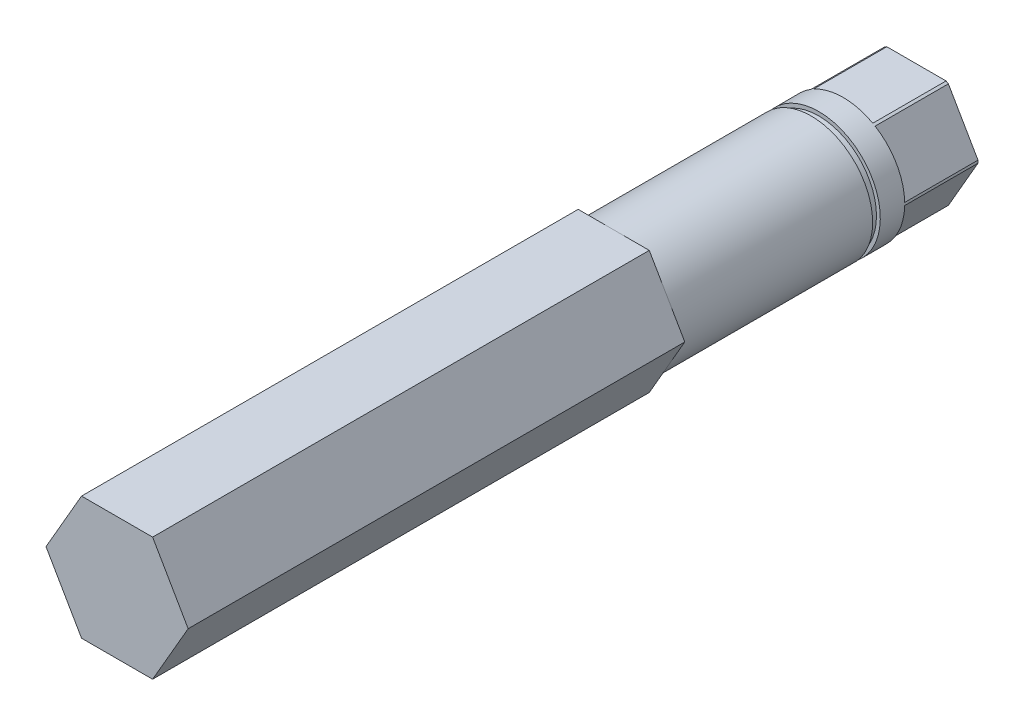
ISO-10303-21;
HEADER;
FILE_DESCRIPTION(('STEP AP214'),'2;1');
FILE_NAME('part.step','',(''),(''),'','','');
FILE_SCHEMA(('AUTOMOTIVE_DESIGN { 1 0 10303 214 1 1 1 1 }'));
ENDSEC;
DATA;
#1=APPLICATION_CONTEXT('core data for automotive mechanical design processes');
#2=APPLICATION_PROTOCOL_DEFINITION('international standard','automotive_design',2000,#1);
#3=PRODUCT_CONTEXT('',#1,'mechanical');
#4=PRODUCT('Part','Part','',(#3));
#5=PRODUCT_RELATED_PRODUCT_CATEGORY('part','',(#4));
#6=PRODUCT_DEFINITION_FORMATION('','',#4);
#7=PRODUCT_DEFINITION_CONTEXT('part definition',#1,'design');
#8=PRODUCT_DEFINITION('design','',#6,#7);
#9=PRODUCT_DEFINITION_SHAPE('','',#8);
#10=(LENGTH_UNIT() NAMED_UNIT(*) SI_UNIT(.MILLI.,.METRE.));
#11=(NAMED_UNIT(*) PLANE_ANGLE_UNIT() SI_UNIT($,.RADIAN.));
#12=(NAMED_UNIT(*) SI_UNIT($,.STERADIAN.) SOLID_ANGLE_UNIT());
#13=UNCERTAINTY_MEASURE_WITH_UNIT(LENGTH_MEASURE(1.E-05),#10,'distance_accuracy_value','');
#14=(GEOMETRIC_REPRESENTATION_CONTEXT(3) GLOBAL_UNCERTAINTY_ASSIGNED_CONTEXT((#13)) GLOBAL_UNIT_ASSIGNED_CONTEXT((#10,
#11,#12)) REPRESENTATION_CONTEXT('',''));
#15=CARTESIAN_POINT('',(0.,0.,0.));
#16=DIRECTION('',(0.,0.,1.));
#17=DIRECTION('',(1.,0.,0.));
#18=AXIS2_PLACEMENT_3D('',#15,#16,#17);
#19=CARTESIAN_POINT('',(-3.65884186093545,6.33729999999999,25.7302));
#20=DIRECTION('',(0.866025403784441,-0.499999999999995,0.));
#21=DIRECTION('',(0.499999999999995,0.866025403784441,0.));
#22=AXIS2_PLACEMENT_3D('',#19,#20,#21);
#23=PLANE('',#22);
#24=DIRECTION('',(-0.499999999999989,-0.866025403784445,0.));
#25=VECTOR('',#24,1.);
#26=CARTESIAN_POINT('',(-3.65884186093553,6.33729999999994,51.1302));
#27=LINE('',#26,#25);
#28=CARTESIAN_POINT('',(-3.65884186093553,6.33729999999994,51.1302));
#29=VERTEX_POINT('',#28);
#30=CARTESIAN_POINT('',(-7.31768372187083,0.,51.1302));
#31=VERTEX_POINT('',#30);
#32=EDGE_CURVE('E195',#29,#31,#27,.T.);
#33=ORIENTED_EDGE('',*,*,#32,.F.);
#34=DIRECTION('',(0.,0.,1.));
#35=VECTOR('',#34,1.);
#36=CARTESIAN_POINT('',(-3.65884186093544,6.3373,0.));
#37=LINE('',#36,#35);
#38=CARTESIAN_POINT('',(-3.65884186093545,6.33729999999999,0.));
#39=VERTEX_POINT('',#38);
#40=EDGE_CURVE('E201',#39,#29,#37,.T.);
#41=ORIENTED_EDGE('',*,*,#40,.F.);
#42=DIRECTION('',(0.499999999999995,0.866025403784441,0.));
#43=VECTOR('',#42,1.);
#44=CARTESIAN_POINT('',(-5.48826279140314,3.16864999999997,0.));
#45=LINE('',#44,#43);
#46=CARTESIAN_POINT('',(-5.48826279140314,3.16864999999997,0.));
#47=VERTEX_POINT('',#46);
#48=EDGE_CURVE('E317',#47,#39,#45,.T.);
#49=ORIENTED_EDGE('',*,*,#48,.F.);
#50=DIRECTION('',(0.499999999999995,0.866025403784442,0.));
#51=VECTOR('',#50,1.);
#52=CARTESIAN_POINT('',(-7.31768372187083,0.,0.));
#53=LINE('',#52,#51);
#54=CARTESIAN_POINT('',(-7.31768372187083,0.,0.));
#55=VERTEX_POINT('',#54);
#56=EDGE_CURVE('E198',#55,#47,#53,.T.);
#57=ORIENTED_EDGE('',*,*,#56,.F.);
#58=DIRECTION('',(0.,0.,1.));
#59=VECTOR('',#58,1.);
#60=CARTESIAN_POINT('',(-7.31768372187083,0.,0.));
#61=LINE('',#60,#59);
#62=EDGE_CURVE('E54',#55,#31,#61,.T.);
#63=ORIENTED_EDGE('',*,*,#62,.T.);
#64=EDGE_LOOP('',(#33,#41,#49,#57,#63));
#65=FACE_BOUND('',#64,.T.);
#66=ADVANCED_FACE('F45',(#65),#23,.F.);
#67=CARTESIAN_POINT('',(3.6588418609354,6.33730000000001,25.7302));
#68=DIRECTION('',(0.,-1.,0.));
#69=DIRECTION('',(1.,0.,0.));
#70=AXIS2_PLACEMENT_3D('',#67,#68,#69);
#71=PLANE('',#70);
#72=DIRECTION('',(-1.,0.,0.));
#73=VECTOR('',#72,1.);
#74=CARTESIAN_POINT('',(3.65884186093531,6.33730000000006,51.1302));
#75=LINE('',#74,#73);
#76=CARTESIAN_POINT('',(3.65884186093531,6.33730000000006,51.1302));
#77=VERTEX_POINT('',#76);
#78=EDGE_CURVE('E217',#77,#29,#75,.T.);
#79=ORIENTED_EDGE('',*,*,#78,.F.);
#80=DIRECTION('',(0.,0.,1.));
#81=VECTOR('',#80,1.);
#82=CARTESIAN_POINT('',(3.6588418609354,6.33730000000001,0.));
#83=LINE('',#82,#81);
#84=CARTESIAN_POINT('',(3.6588418609354,6.33730000000001,0.));
#85=VERTEX_POINT('',#84);
#86=EDGE_CURVE('E364',#85,#77,#83,.T.);
#87=ORIENTED_EDGE('',*,*,#86,.F.);
#88=DIRECTION('',(1.,0.,0.));
#89=VECTOR('',#88,1.);
#90=CARTESIAN_POINT('',(0.,6.33730000000001,0.));
#91=LINE('',#90,#89);
#92=CARTESIAN_POINT('',(0.,6.33730000000001,0.));
#93=VERTEX_POINT('',#92);
#94=EDGE_CURVE('E324',#93,#85,#91,.T.);
#95=ORIENTED_EDGE('',*,*,#94,.F.);
#96=DIRECTION('',(1.,0.,0.));
#97=VECTOR('',#96,1.);
#98=CARTESIAN_POINT('',(-3.65884186093545,6.33729999999999,0.));
#99=LINE('',#98,#97);
#100=EDGE_CURVE('E319',#39,#93,#99,.T.);
#101=ORIENTED_EDGE('',*,*,#100,.F.);
#102=ORIENTED_EDGE('',*,*,#40,.T.);
#103=EDGE_LOOP('',(#79,#87,#95,#101,#102));
#104=FACE_BOUND('',#103,.T.);
#105=ADVANCED_FACE('F47',(#104),#71,.F.);
#106=CARTESIAN_POINT('',(7.31768372187083,0.,25.7302));
#107=DIRECTION('',(-0.866025403784438,-0.500000000000001,0.));
#108=DIRECTION('',(0.500000000000001,-0.866025403784438,0.));
#109=AXIS2_PLACEMENT_3D('',#106,#107,#108);
#110=PLANE('',#109);
#111=ORIENTED_EDGE('',*,*,#86,.T.);
#112=DIRECTION('',(-0.500000000000013,0.866025403784431,0.));
#113=VECTOR('',#112,1.);
#114=CARTESIAN_POINT('',(7.31768372187083,1.01692898884307E-13,51.1302));
#115=LINE('',#114,#113);
#116=CARTESIAN_POINT('',(7.31768372187083,1.01692898884307E-13,51.1302));
#117=VERTEX_POINT('',#116);
#118=EDGE_CURVE('E224',#117,#77,#115,.T.);
#119=ORIENTED_EDGE('',*,*,#118,.F.);
#120=DIRECTION('',(0.,0.,1.));
#121=VECTOR('',#120,1.);
#122=CARTESIAN_POINT('',(7.31768372187083,0.,0.));
#123=LINE('',#122,#121);
#124=CARTESIAN_POINT('',(7.31768372187083,0.,0.));
#125=VERTEX_POINT('',#124);
#126=EDGE_CURVE('E361',#125,#117,#123,.T.);
#127=ORIENTED_EDGE('',*,*,#126,.F.);
#128=DIRECTION('',(0.500000000000001,-0.866025403784438,0.));
#129=VECTOR('',#128,1.);
#130=CARTESIAN_POINT('',(5.48826279140312,3.16865000000001,0.));
#131=LINE('',#130,#129);
#132=CARTESIAN_POINT('',(5.48826279140312,3.16865000000001,0.));
#133=VERTEX_POINT('',#132);
#134=EDGE_CURVE('E331',#133,#125,#131,.T.);
#135=ORIENTED_EDGE('',*,*,#134,.F.);
#136=DIRECTION('',(0.500000000000001,-0.866025403784438,0.));
#137=VECTOR('',#136,1.);
#138=CARTESIAN_POINT('',(3.6588418609354,6.33730000000001,0.));
#139=LINE('',#138,#137);
#140=EDGE_CURVE('E326',#85,#133,#139,.T.);
#141=ORIENTED_EDGE('',*,*,#140,.F.);
#142=EDGE_LOOP('',(#111,#119,#127,#135,#141));
#143=FACE_BOUND('',#142,.T.);
#144=ADVANCED_FACE('F378',(#143),#110,.F.);
#145=CARTESIAN_POINT('',(3.65884186093549,-6.33729999999996,25.7302));
#146=DIRECTION('',(-0.866025403784442,0.499999999999995,0.));
#147=DIRECTION('',(-0.499999999999995,-0.866025403784442,0.));
#148=AXIS2_PLACEMENT_3D('',#145,#146,#147);
#149=PLANE('',#148);
#150=ORIENTED_EDGE('',*,*,#126,.T.);
#151=DIRECTION('',(0.499999999999989,0.866025403784445,0.));
#152=VECTOR('',#151,1.);
#153=CARTESIAN_POINT('',(3.65884186093549,-6.33729999999996,51.1302));
#154=LINE('',#153,#152);
#155=CARTESIAN_POINT('',(3.65884186093549,-6.33729999999996,51.1302));
#156=VERTEX_POINT('',#155);
#157=EDGE_CURVE('E221',#156,#117,#154,.T.);
#158=ORIENTED_EDGE('',*,*,#157,.F.);
#159=DIRECTION('',(0.,0.,1.));
#160=VECTOR('',#159,1.);
#161=CARTESIAN_POINT('',(3.65884186093547,-6.3373,0.));
#162=LINE('',#161,#160);
#163=CARTESIAN_POINT('',(3.65884186093547,-6.3373,0.));
#164=VERTEX_POINT('',#163);
#165=EDGE_CURVE('E358',#164,#156,#162,.T.);
#166=ORIENTED_EDGE('',*,*,#165,.F.);
#167=DIRECTION('',(-0.499999999999992,-0.866025403784443,0.));
#168=VECTOR('',#167,1.);
#169=CARTESIAN_POINT('',(5.48826279140315,-3.16864999999997,0.));
#170=LINE('',#169,#168);
#171=CARTESIAN_POINT('',(5.48826279140315,-3.16864999999997,0.));
#172=VERTEX_POINT('',#171);
#173=EDGE_CURVE('E338',#172,#164,#170,.T.);
#174=ORIENTED_EDGE('',*,*,#173,.F.);
#175=DIRECTION('',(-0.499999999999998,-0.86602540378444,0.));
#176=VECTOR('',#175,1.);
#177=CARTESIAN_POINT('',(7.31768372187083,0.,0.));
#178=LINE('',#177,#176);
#179=EDGE_CURVE('E333',#125,#172,#178,.T.);
#180=ORIENTED_EDGE('',*,*,#179,.F.);
#181=EDGE_LOOP('',(#150,#158,#166,#174,#180));
#182=FACE_BOUND('',#181,.T.);
#183=ADVANCED_FACE('F388',(#182),#149,.F.);
#184=CARTESIAN_POINT('',(-3.65884186093536,-6.33730000000004,25.7302));
#185=DIRECTION('',(0.,1.,0.));
#186=DIRECTION('',(-1.,0.,0.));
#187=AXIS2_PLACEMENT_3D('',#184,#185,#186);
#188=PLANE('',#187);
#189=ORIENTED_EDGE('',*,*,#165,.T.);
#190=DIRECTION('',(1.,0.,0.));
#191=VECTOR('',#190,1.);
#192=CARTESIAN_POINT('',(-3.65884186093536,-6.33730000000004,51.1302));
#193=LINE('',#192,#191);
#194=CARTESIAN_POINT('',(-3.65884186093536,-6.33730000000004,51.1302));
#195=VERTEX_POINT('',#194);
#196=EDGE_CURVE('E211',#195,#156,#193,.T.);
#197=ORIENTED_EDGE('',*,*,#196,.F.);
#198=DIRECTION('',(0.,0.,1.));
#199=VECTOR('',#198,1.);
#200=CARTESIAN_POINT('',(-3.65884186093536,-6.33730000000004,0.));
#201=LINE('',#200,#199);
#202=CARTESIAN_POINT('',(-3.65884186093536,-6.33730000000004,0.));
#203=VERTEX_POINT('',#202);
#204=EDGE_CURVE('E207',#203,#195,#201,.T.);
#205=ORIENTED_EDGE('',*,*,#204,.F.);
#206=DIRECTION('',(-1.,0.,0.));
#207=VECTOR('',#206,1.);
#208=CARTESIAN_POINT('',(0.,-6.33730000000002,0.));
#209=LINE('',#208,#207);
#210=CARTESIAN_POINT('',(0.,-6.33730000000002,0.));
#211=VERTEX_POINT('',#210);
#212=EDGE_CURVE('E346',#211,#203,#209,.T.);
#213=ORIENTED_EDGE('',*,*,#212,.F.);
#214=DIRECTION('',(-1.,0.,0.));
#215=VECTOR('',#214,1.);
#216=CARTESIAN_POINT('',(3.65884186093547,-6.3373,0.));
#217=LINE('',#216,#215);
#218=EDGE_CURVE('E340',#164,#211,#217,.T.);
#219=ORIENTED_EDGE('',*,*,#218,.F.);
#220=EDGE_LOOP('',(#189,#197,#205,#213,#219));
#221=FACE_BOUND('',#220,.T.);
#222=ADVANCED_FACE('F397',(#221),#188,.F.);
#223=CARTESIAN_POINT('',(-7.31768372187083,0.,25.7302));
#224=DIRECTION('',(0.866025403784435,0.500000000000007,0.));
#225=DIRECTION('',(-0.500000000000007,0.866025403784435,0.));
#226=AXIS2_PLACEMENT_3D('',#223,#224,#225);
#227=PLANE('',#226);
#228=DIRECTION('',(0.500000000000007,-0.866025403784435,0.));
#229=VECTOR('',#228,1.);
#230=CARTESIAN_POINT('',(-7.31768372187083,0.,51.1302));
#231=LINE('',#230,#229);
#232=EDGE_CURVE('E203',#31,#195,#231,.T.);
#233=ORIENTED_EDGE('',*,*,#232,.F.);
#234=ORIENTED_EDGE('',*,*,#62,.F.);
#235=DIRECTION('',(-0.500000000000007,0.866025403784435,0.));
#236=VECTOR('',#235,1.);
#237=CARTESIAN_POINT('',(-5.4882627914031,-3.16865000000004,0.));
#238=LINE('',#237,#236);
#239=CARTESIAN_POINT('',(-5.4882627914031,-3.16865000000004,0.));
#240=VERTEX_POINT('',#239);
#241=EDGE_CURVE('E311',#240,#55,#238,.T.);
#242=ORIENTED_EDGE('',*,*,#241,.F.);
#243=DIRECTION('',(-0.500000000000007,0.866025403784435,0.));
#244=VECTOR('',#243,1.);
#245=CARTESIAN_POINT('',(-3.65884186093536,-6.33730000000004,0.));
#246=LINE('',#245,#244);
#247=EDGE_CURVE('E348',#203,#240,#246,.T.);
#248=ORIENTED_EDGE('',*,*,#247,.F.);
#249=ORIENTED_EDGE('',*,*,#204,.T.);
#250=EDGE_LOOP('',(#233,#234,#242,#248,#249));
#251=FACE_BOUND('',#250,.T.);
#252=ADVANCED_FACE('F204',(#251),#227,.F.);
#253=CARTESIAN_POINT('',(0.,0.,-20.32));
#254=DIRECTION('',(0.,0.,1.));
#255=DIRECTION('',(1.,0.,0.));
#256=AXIS2_PLACEMENT_3D('',#253,#254,#255);
#257=PLANE('',#256);
#258=CARTESIAN_POINT('',(0.,0.,-20.32));
#259=DIRECTION('',(0.,0.,1.));
#260=DIRECTION('',(1.,0.,0.));
#261=AXIS2_PLACEMENT_3D('',#258,#259,#260);
#262=CIRCLE('',#261,5.9436);
#263=CARTESIAN_POINT('',(5.9436,0.,-20.32));
#264=VERTEX_POINT('',#263);
#265=EDGE_CURVE('E13',#264,#264,#262,.F.);
#266=ORIENTED_EDGE('',*,*,#265,.F.);
#267=EDGE_LOOP('',(#266));
#268=FACE_BOUND('',#267,.T.);
#269=CARTESIAN_POINT('',(0.,0.,-20.32));
#270=DIRECTION('',(0.,0.,1.));
#271=DIRECTION('',(1.,0.,0.));
#272=AXIS2_PLACEMENT_3D('',#269,#270,#271);
#273=CIRCLE('',#272,6.33730000000001);
#274=CARTESIAN_POINT('',(6.33730000000001,0.,-20.32));
#275=VERTEX_POINT('',#274);
#276=EDGE_CURVE('E342',#275,#275,#273,.T.);
#277=ORIENTED_EDGE('',*,*,#276,.F.);
#278=EDGE_LOOP('',(#277));
#279=FACE_BOUND('',#278,.T.);
#280=ADVANCED_FACE('F928',(#268,#279),#257,.F.);
#281=CARTESIAN_POINT('',(0.,0.,0.));
#282=DIRECTION('',(0.,0.,-1.));
#283=DIRECTION('',(-1.,0.,0.));
#284=AXIS2_PLACEMENT_3D('',#281,#282,#283);
#285=CYLINDRICAL_SURFACE('',#284,6.33730000000001);
#286=ORIENTED_EDGE('',*,*,#276,.T.);
#287=EDGE_LOOP('',(#286));
#288=FACE_BOUND('',#287,.T.);
#289=CARTESIAN_POINT('',(0.,0.,0.));
#290=DIRECTION('',(0.,0.,1.));
#291=DIRECTION('',(1.,0.,0.));
#292=AXIS2_PLACEMENT_3D('',#289,#290,#291);
#293=CIRCLE('',#292,6.3373);
#294=EDGE_CURVE('E309',#47,#240,#293,.T.);
#295=ORIENTED_EDGE('',*,*,#294,.F.);
#296=CARTESIAN_POINT('',(0.,0.,0.));
#297=DIRECTION('',(0.,0.,1.));
#298=DIRECTION('',(1.,0.,0.));
#299=AXIS2_PLACEMENT_3D('',#296,#297,#298);
#300=CIRCLE('',#299,6.3373);
#301=EDGE_CURVE('E314',#93,#47,#300,.T.);
#302=ORIENTED_EDGE('',*,*,#301,.F.);
#303=CARTESIAN_POINT('',(0.,0.,0.));
#304=DIRECTION('',(0.,0.,1.));
#305=DIRECTION('',(1.,0.,0.));
#306=AXIS2_PLACEMENT_3D('',#303,#304,#305);
#307=CIRCLE('',#306,6.3373);
#308=EDGE_CURVE('E321',#133,#93,#307,.T.);
#309=ORIENTED_EDGE('',*,*,#308,.F.);
#310=CARTESIAN_POINT('',(0.,0.,0.));
#311=DIRECTION('',(0.,0.,1.));
#312=DIRECTION('',(1.,0.,0.));
#313=AXIS2_PLACEMENT_3D('',#310,#311,#312);
#314=CIRCLE('',#313,6.33730000000001);
#315=EDGE_CURVE('E328',#172,#133,#314,.T.);
#316=ORIENTED_EDGE('',*,*,#315,.F.);
#317=CARTESIAN_POINT('',(0.,0.,0.));
#318=DIRECTION('',(0.,0.,1.));
#319=DIRECTION('',(1.,0.,0.));
#320=AXIS2_PLACEMENT_3D('',#317,#318,#319);
#321=CIRCLE('',#320,6.33730000000002);
#322=EDGE_CURVE('E335',#211,#172,#321,.T.);
#323=ORIENTED_EDGE('',*,*,#322,.F.);
#324=CARTESIAN_POINT('',(0.,0.,0.));
#325=DIRECTION('',(0.,0.,1.));
#326=DIRECTION('',(1.,0.,0.));
#327=AXIS2_PLACEMENT_3D('',#324,#325,#326);
#328=CIRCLE('',#327,6.33730000000001);
#329=EDGE_CURVE('E343',#240,#211,#328,.T.);
#330=ORIENTED_EDGE('',*,*,#329,.F.);
#331=EDGE_LOOP('',(#295,#302,#309,#316,#323,#330));
#332=FACE_BOUND('',#331,.T.);
#333=ADVANCED_FACE('F898',(#288,#332),#285,.T.);
#334=CARTESIAN_POINT('',(0.,0.,0.));
#335=DIRECTION('',(0.,0.,1.));
#336=DIRECTION('',(1.,0.,0.));
#337=AXIS2_PLACEMENT_3D('',#334,#335,#336);
#338=PLANE('',#337);
#339=ORIENTED_EDGE('',*,*,#329,.T.);
#340=ORIENTED_EDGE('',*,*,#212,.T.);
#341=ORIENTED_EDGE('',*,*,#247,.T.);
#342=EDGE_LOOP('',(#339,#340,#341));
#343=FACE_BOUND('',#342,.T.);
#344=ADVANCED_FACE('F906',(#343),#338,.F.);
#345=CARTESIAN_POINT('',(0.,0.,0.));
#346=DIRECTION('',(0.,0.,1.));
#347=DIRECTION('',(1.,0.,0.));
#348=AXIS2_PLACEMENT_3D('',#345,#346,#347);
#349=PLANE('',#348);
#350=ORIENTED_EDGE('',*,*,#322,.T.);
#351=ORIENTED_EDGE('',*,*,#173,.T.);
#352=ORIENTED_EDGE('',*,*,#218,.T.);
#353=EDGE_LOOP('',(#350,#351,#352));
#354=FACE_BOUND('',#353,.T.);
#355=ADVANCED_FACE('F902',(#354),#349,.F.);
#356=CARTESIAN_POINT('',(0.,0.,0.));
#357=DIRECTION('',(0.,0.,1.));
#358=DIRECTION('',(1.,0.,0.));
#359=AXIS2_PLACEMENT_3D('',#356,#357,#358);
#360=PLANE('',#359);
#361=ORIENTED_EDGE('',*,*,#315,.T.);
#362=ORIENTED_EDGE('',*,*,#134,.T.);
#363=ORIENTED_EDGE('',*,*,#179,.T.);
#364=EDGE_LOOP('',(#361,#362,#363));
#365=FACE_BOUND('',#364,.T.);
#366=ADVANCED_FACE('F893',(#365),#360,.F.);
#367=CARTESIAN_POINT('',(0.,0.,0.));
#368=DIRECTION('',(0.,0.,1.));
#369=DIRECTION('',(1.,0.,0.));
#370=AXIS2_PLACEMENT_3D('',#367,#368,#369);
#371=PLANE('',#370);
#372=ORIENTED_EDGE('',*,*,#308,.T.);
#373=ORIENTED_EDGE('',*,*,#94,.T.);
#374=ORIENTED_EDGE('',*,*,#140,.T.);
#375=EDGE_LOOP('',(#372,#373,#374));
#376=FACE_BOUND('',#375,.T.);
#377=ADVANCED_FACE('F912',(#376),#371,.F.);
#378=CARTESIAN_POINT('',(0.,0.,0.));
#379=DIRECTION('',(0.,0.,1.));
#380=DIRECTION('',(1.,0.,0.));
#381=AXIS2_PLACEMENT_3D('',#378,#379,#380);
#382=PLANE('',#381);
#383=ORIENTED_EDGE('',*,*,#301,.T.);
#384=ORIENTED_EDGE('',*,*,#48,.T.);
#385=ORIENTED_EDGE('',*,*,#100,.T.);
#386=EDGE_LOOP('',(#383,#384,#385));
#387=FACE_BOUND('',#386,.T.);
#388=ADVANCED_FACE('F910',(#387),#382,.F.);
#389=CARTESIAN_POINT('',(0.,0.,0.));
#390=DIRECTION('',(0.,0.,1.));
#391=DIRECTION('',(1.,0.,0.));
#392=AXIS2_PLACEMENT_3D('',#389,#390,#391);
#393=PLANE('',#392);
#394=ORIENTED_EDGE('',*,*,#294,.T.);
#395=ORIENTED_EDGE('',*,*,#241,.T.);
#396=ORIENTED_EDGE('',*,*,#56,.T.);
#397=EDGE_LOOP('',(#394,#395,#396));
#398=FACE_BOUND('',#397,.T.);
#399=ADVANCED_FACE('F908',(#398),#393,.F.);
#400=CARTESIAN_POINT('',(0.,0.,-21.1074));
#401=DIRECTION('',(0.,0.,1.));
#402=DIRECTION('',(1.,0.,0.));
#403=AXIS2_PLACEMENT_3D('',#400,#401,#402);
#404=CYLINDRICAL_SURFACE('',#403,5.9436);
#405=CARTESIAN_POINT('',(0.,0.,-21.1074));
#406=DIRECTION('',(0.,0.,-1.));
#407=DIRECTION('',(-1.,0.,0.));
#408=AXIS2_PLACEMENT_3D('',#405,#406,#407);
#409=CIRCLE('',#408,5.9436);
#410=CARTESIAN_POINT('',(-5.9436,0.,-21.1074));
#411=VERTEX_POINT('',#410);
#412=EDGE_CURVE('E302',#411,#411,#409,.T.);
#413=ORIENTED_EDGE('',*,*,#412,.F.);
#414=EDGE_LOOP('',(#413));
#415=FACE_BOUND('',#414,.T.);
#416=ORIENTED_EDGE('',*,*,#265,.T.);
#417=EDGE_LOOP('',(#416));
#418=FACE_BOUND('',#417,.T.);
#419=ADVANCED_FACE('F939',(#415,#418),#404,.T.);
#420=CARTESIAN_POINT('',(0.,0.,-31.1658));
#421=DIRECTION('',(0.,0.,1.));
#422=DIRECTION('',(1.,0.,0.));
#423=AXIS2_PLACEMENT_3D('',#420,#421,#422);
#424=CYLINDRICAL_SURFACE('',#423,6.3373);
#425=DIRECTION('',(0.,0.,-1.));
#426=VECTOR('',#425,1.);
#427=CARTESIAN_POINT('',(3.28792310448494,-5.41765013165247,-23.622));
#428=LINE('',#427,#426);
#429=CARTESIAN_POINT('',(3.28792310448494,-5.41765013165247,-23.622));
#430=VERTEX_POINT('',#429);
#431=CARTESIAN_POINT('',(3.28792310448495,-5.41765013165247,-31.1658));
#432=VERTEX_POINT('',#431);
#433=EDGE_CURVE('E61',#430,#432,#428,.T.);
#434=ORIENTED_EDGE('',*,*,#433,.F.);
#435=CARTESIAN_POINT('',(0.,0.,-23.622));
#436=DIRECTION('',(0.,0.,-1.));
#437=DIRECTION('',(-1.,0.,0.));
#438=AXIS2_PLACEMENT_3D('',#435,#436,#437);
#439=CIRCLE('',#438,6.3373);
#440=CARTESIAN_POINT('',(6.33578419506962,-0.138599868347528,-23.622));
#441=VERTEX_POINT('',#440);
#442=EDGE_CURVE('E228',#441,#430,#439,.T.);
#443=ORIENTED_EDGE('',*,*,#442,.F.);
#444=DIRECTION('',(0.,0.,-1.));
#445=VECTOR('',#444,1.);
#446=CARTESIAN_POINT('',(6.33578419506962,-0.138599868347528,-23.622));
#447=LINE('',#446,#445);
#448=CARTESIAN_POINT('',(6.33578419506962,-0.138599868347528,-31.1658));
#449=VERTEX_POINT('',#448);
#450=EDGE_CURVE('E234',#441,#449,#447,.T.);
#451=ORIENTED_EDGE('',*,*,#450,.T.);
#452=CARTESIAN_POINT('',(0.,0.,-31.1658));
#453=DIRECTION('',(0.,0.,1.));
#454=DIRECTION('',(-1.,0.,0.));
#455=AXIS2_PLACEMENT_3D('',#452,#453,#454);
#456=CIRCLE('',#455,6.3373);
#457=CARTESIAN_POINT('',(6.33578419506963,0.138599868347533,-31.1658));
#458=VERTEX_POINT('',#457);
#459=EDGE_CURVE('E304',#449,#458,#456,.T.);
#460=ORIENTED_EDGE('',*,*,#459,.T.);
#461=DIRECTION('',(0.,0.,-1.));
#462=VECTOR('',#461,1.);
#463=CARTESIAN_POINT('',(6.33578419506962,0.138599868347528,-23.622));
#464=LINE('',#463,#462);
#465=CARTESIAN_POINT('',(6.33578419506962,0.138599868347528,-23.622));
#466=VERTEX_POINT('',#465);
#467=EDGE_CURVE('E291',#466,#458,#464,.T.);
#468=ORIENTED_EDGE('',*,*,#467,.F.);
#469=CARTESIAN_POINT('',(0.,0.,-23.622));
#470=DIRECTION('',(0.,0.,-1.));
#471=DIRECTION('',(-1.,0.,0.));
#472=AXIS2_PLACEMENT_3D('',#469,#470,#471);
#473=CIRCLE('',#472,6.3373);
#474=CARTESIAN_POINT('',(3.28792310448495,5.41765013165247,-23.622));
#475=VERTEX_POINT('',#474);
#476=EDGE_CURVE('E286',#475,#466,#473,.T.);
#477=ORIENTED_EDGE('',*,*,#476,.F.);
#478=DIRECTION('',(0.,0.,-1.));
#479=VECTOR('',#478,1.);
#480=CARTESIAN_POINT('',(3.28792310448495,5.41765013165247,-23.622));
#481=LINE('',#480,#479);
#482=CARTESIAN_POINT('',(3.28792310448495,5.41765013165247,-31.1658));
#483=VERTEX_POINT('',#482);
#484=EDGE_CURVE('E293',#475,#483,#481,.T.);
#485=ORIENTED_EDGE('',*,*,#484,.T.);
#486=CARTESIAN_POINT('',(3.04786109058467,5.55625,-31.1658));
#487=VERTEX_POINT('',#486);
#488=EDGE_CURVE('E299',#483,#487,#456,.T.);
#489=ORIENTED_EDGE('',*,*,#488,.T.);
#490=DIRECTION('',(0.,0.,-1.));
#491=VECTOR('',#490,1.);
#492=CARTESIAN_POINT('',(3.04786109058467,5.55625,-23.622));
#493=LINE('',#492,#491);
#494=CARTESIAN_POINT('',(3.04786109058467,5.55625,-23.622));
#495=VERTEX_POINT('',#494);
#496=EDGE_CURVE('E279',#495,#487,#493,.T.);
#497=ORIENTED_EDGE('',*,*,#496,.F.);
#498=CARTESIAN_POINT('',(0.,0.,-23.622));
#499=DIRECTION('',(0.,0.,-1.));
#500=DIRECTION('',(-1.,0.,0.));
#501=AXIS2_PLACEMENT_3D('',#498,#499,#500);
#502=CIRCLE('',#501,6.3373);
#503=CARTESIAN_POINT('',(-3.04786109058467,5.55625,-23.622));
#504=VERTEX_POINT('',#503);
#505=EDGE_CURVE('E274',#504,#495,#502,.T.);
#506=ORIENTED_EDGE('',*,*,#505,.F.);
#507=DIRECTION('',(0.,0.,-1.));
#508=VECTOR('',#507,1.);
#509=CARTESIAN_POINT('',(-3.04786109058467,5.55625,-23.622));
#510=LINE('',#509,#508);
#511=CARTESIAN_POINT('',(-3.04786109058467,5.55625,-31.1658));
#512=VERTEX_POINT('',#511);
#513=EDGE_CURVE('E281',#504,#512,#510,.T.);
#514=ORIENTED_EDGE('',*,*,#513,.T.);
#515=CARTESIAN_POINT('',(-3.28792310448495,5.41765013165248,-31.1658));
#516=VERTEX_POINT('',#515);
#517=EDGE_CURVE('E303',#512,#516,#456,.T.);
#518=ORIENTED_EDGE('',*,*,#517,.T.);
#519=DIRECTION('',(0.,0.,-1.));
#520=VECTOR('',#519,1.);
#521=CARTESIAN_POINT('',(-3.28792310448494,5.41765013165248,-23.622));
#522=LINE('',#521,#520);
#523=CARTESIAN_POINT('',(-3.28792310448494,5.41765013165248,-23.622));
#524=VERTEX_POINT('',#523);
#525=EDGE_CURVE('E267',#524,#516,#522,.T.);
#526=ORIENTED_EDGE('',*,*,#525,.F.);
#527=CARTESIAN_POINT('',(0.,0.,-23.622));
#528=DIRECTION('',(0.,0.,-1.));
#529=DIRECTION('',(-1.,0.,0.));
#530=AXIS2_PLACEMENT_3D('',#527,#528,#529);
#531=CIRCLE('',#530,6.3373);
#532=CARTESIAN_POINT('',(-6.33578419506962,0.138599868347532,-23.622));
#533=VERTEX_POINT('',#532);
#534=EDGE_CURVE('E262',#533,#524,#531,.T.);
#535=ORIENTED_EDGE('',*,*,#534,.F.);
#536=DIRECTION('',(0.,0.,-1.));
#537=VECTOR('',#536,1.);
#538=CARTESIAN_POINT('',(-6.33578419506962,0.138599868347532,-23.622));
#539=LINE('',#538,#537);
#540=CARTESIAN_POINT('',(-6.33578419506962,0.138599868347532,-31.1658));
#541=VERTEX_POINT('',#540);
#542=EDGE_CURVE('E269',#533,#541,#539,.T.);
#543=ORIENTED_EDGE('',*,*,#542,.T.);
#544=CARTESIAN_POINT('',(-6.33578419506962,-0.138599868347527,-31.1658));
#545=VERTEX_POINT('',#544);
#546=EDGE_CURVE('E1288',#541,#545,#456,.T.);
#547=ORIENTED_EDGE('',*,*,#546,.T.);
#548=DIRECTION('',(0.,0.,-1.));
#549=VECTOR('',#548,1.);
#550=CARTESIAN_POINT('',(-6.33578419506962,-0.138599868347528,-23.622));
#551=LINE('',#550,#549);
#552=CARTESIAN_POINT('',(-6.33578419506962,-0.138599868347528,-23.622));
#553=VERTEX_POINT('',#552);
#554=EDGE_CURVE('E255',#553,#545,#551,.T.);
#555=ORIENTED_EDGE('',*,*,#554,.F.);
#556=CARTESIAN_POINT('',(0.,0.,-23.622));
#557=DIRECTION('',(0.,0.,-1.));
#558=DIRECTION('',(-1.,0.,0.));
#559=AXIS2_PLACEMENT_3D('',#556,#557,#558);
#560=CIRCLE('',#559,6.3373);
#561=CARTESIAN_POINT('',(-3.28792310448495,-5.41765013165247,-23.622));
#562=VERTEX_POINT('',#561);
#563=EDGE_CURVE('E250',#562,#553,#560,.T.);
#564=ORIENTED_EDGE('',*,*,#563,.F.);
#565=DIRECTION('',(0.,0.,-1.));
#566=VECTOR('',#565,1.);
#567=CARTESIAN_POINT('',(-3.28792310448495,-5.41765013165247,-23.622));
#568=LINE('',#567,#566);
#569=CARTESIAN_POINT('',(-3.28792310448495,-5.41765013165247,-31.1658));
#570=VERTEX_POINT('',#569);
#571=EDGE_CURVE('E257',#562,#570,#568,.T.);
#572=ORIENTED_EDGE('',*,*,#571,.T.);
#573=CARTESIAN_POINT('',(-3.04786109058467,-5.55625,-31.1658));
#574=VERTEX_POINT('',#573);
#575=EDGE_CURVE('E1286',#570,#574,#456,.T.);
#576=ORIENTED_EDGE('',*,*,#575,.T.);
#577=DIRECTION('',(0.,0.,-1.));
#578=VECTOR('',#577,1.);
#579=CARTESIAN_POINT('',(-3.04786109058467,-5.55625,-23.622));
#580=LINE('',#579,#578);
#581=CARTESIAN_POINT('',(-3.04786109058467,-5.55625,-23.622));
#582=VERTEX_POINT('',#581);
#583=EDGE_CURVE('E69',#582,#574,#580,.T.);
#584=ORIENTED_EDGE('',*,*,#583,.F.);
#585=CARTESIAN_POINT('',(0.,0.,-23.622));
#586=DIRECTION('',(0.,0.,-1.));
#587=DIRECTION('',(-1.,0.,0.));
#588=AXIS2_PLACEMENT_3D('',#585,#586,#587);
#589=CIRCLE('',#588,6.3373);
#590=CARTESIAN_POINT('',(3.04786109058467,-5.55625,-23.622));
#591=VERTEX_POINT('',#590);
#592=EDGE_CURVE('E239',#591,#582,#589,.T.);
#593=ORIENTED_EDGE('',*,*,#592,.F.);
#594=DIRECTION('',(0.,0.,-1.));
#595=VECTOR('',#594,1.);
#596=CARTESIAN_POINT('',(3.04786109058467,-5.55625,-23.622));
#597=LINE('',#596,#595);
#598=CARTESIAN_POINT('',(3.04786109058467,-5.55625,-31.1658));
#599=VERTEX_POINT('',#598);
#600=EDGE_CURVE('E245',#591,#599,#597,.T.);
#601=ORIENTED_EDGE('',*,*,#600,.T.);
#602=EDGE_CURVE('E1284',#599,#432,#456,.T.);
#603=ORIENTED_EDGE('',*,*,#602,.T.);
#604=EDGE_LOOP('',(#434,#443,#451,#460,#468,#477,#485,#489,#497,#506,#514,#518,#526,#535,#543,
#547,#555,#564,#572,#576,#584,#593,#601,#603));
#605=FACE_BOUND('',#604,.T.);
#606=CARTESIAN_POINT('',(0.,0.,-21.1074));
#607=DIRECTION('',(0.,0.,1.));
#608=DIRECTION('',(-1.,0.,0.));
#609=AXIS2_PLACEMENT_3D('',#606,#607,#608);
#610=CIRCLE('',#609,6.3373);
#611=CARTESIAN_POINT('',(-6.3373,0.,-21.1074));
#612=VERTEX_POINT('',#611);
#613=EDGE_CURVE('E296',#612,#612,#610,.T.);
#614=ORIENTED_EDGE('',*,*,#613,.F.);
#615=EDGE_LOOP('',(#614));
#616=FACE_BOUND('',#615,.T.);
#617=ADVANCED_FACE('F941',(#605,#616),#424,.T.);
#618=CARTESIAN_POINT('',(0.,0.,-31.1658));
#619=DIRECTION('',(0.,0.,-1.));
#620=DIRECTION('',(-1.,0.,0.));
#621=AXIS2_PLACEMENT_3D('',#618,#619,#620);
#622=PLANE('',#621);
#623=DIRECTION('',(0.500000000000001,0.866025403784438,0.));
#624=VECTOR('',#623,1.);
#625=CARTESIAN_POINT('',(3.28792310448494,-5.41765013165247,-31.1658));
#626=LINE('',#625,#624);
#627=EDGE_CURVE('E227',#432,#449,#626,.T.);
#628=ORIENTED_EDGE('',*,*,#627,.F.);
#629=ORIENTED_EDGE('',*,*,#602,.F.);
#630=DIRECTION('',(1.,0.,0.));
#631=VECTOR('',#630,1.);
#632=CARTESIAN_POINT('',(-3.04786109058467,-5.55625,-31.1658));
#633=LINE('',#632,#631);
#634=EDGE_CURVE('E237',#574,#599,#633,.T.);
#635=ORIENTED_EDGE('',*,*,#634,.F.);
#636=ORIENTED_EDGE('',*,*,#575,.F.);
#637=DIRECTION('',(0.5,-0.866025403784439,0.));
#638=VECTOR('',#637,1.);
#639=CARTESIAN_POINT('',(-6.33578419506962,-0.138599868347528,-31.1658));
#640=LINE('',#639,#638);
#641=EDGE_CURVE('E248',#545,#570,#640,.T.);
#642=ORIENTED_EDGE('',*,*,#641,.F.);
#643=ORIENTED_EDGE('',*,*,#546,.F.);
#644=DIRECTION('',(-0.500000000000001,-0.866025403784438,0.));
#645=VECTOR('',#644,1.);
#646=CARTESIAN_POINT('',(-3.28792310448494,5.41765013165248,-31.1658));
#647=LINE('',#646,#645);
#648=EDGE_CURVE('E260',#516,#541,#647,.T.);
#649=ORIENTED_EDGE('',*,*,#648,.F.);
#650=ORIENTED_EDGE('',*,*,#517,.F.);
#651=DIRECTION('',(-1.,0.,0.));
#652=VECTOR('',#651,1.);
#653=CARTESIAN_POINT('',(3.04786109058467,5.55625,-31.1658));
#654=LINE('',#653,#652);
#655=EDGE_CURVE('E272',#487,#512,#654,.T.);
#656=ORIENTED_EDGE('',*,*,#655,.F.);
#657=ORIENTED_EDGE('',*,*,#488,.F.);
#658=DIRECTION('',(-0.5,0.866025403784438,0.));
#659=VECTOR('',#658,1.);
#660=CARTESIAN_POINT('',(6.33578419506962,0.138599868347528,-31.1658));
#661=LINE('',#660,#659);
#662=EDGE_CURVE('E284',#458,#483,#661,.T.);
#663=ORIENTED_EDGE('',*,*,#662,.F.);
#664=ORIENTED_EDGE('',*,*,#459,.F.);
#665=EDGE_LOOP('',(#628,#629,#635,#636,#642,#643,#649,#650,#656,#657,#663,#664));
#666=FACE_BOUND('',#665,.T.);
#667=ADVANCED_FACE('F948',(#666),#622,.T.);
#668=CARTESIAN_POINT('',(0.,0.,-21.1074));
#669=DIRECTION('',(0.,0.,-1.));
#670=DIRECTION('',(-1.,0.,0.));
#671=AXIS2_PLACEMENT_3D('',#668,#669,#670);
#672=PLANE('',#671);
#673=ORIENTED_EDGE('',*,*,#412,.T.);
#674=EDGE_LOOP('',(#673));
#675=FACE_BOUND('',#674,.T.);
#676=ORIENTED_EDGE('',*,*,#613,.T.);
#677=EDGE_LOOP('',(#676));
#678=FACE_BOUND('',#677,.T.);
#679=ADVANCED_FACE('F953',(#675,#678),#672,.F.);
#680=CARTESIAN_POINT('',(6.33578419506962,0.138599868347528,-23.622));
#681=DIRECTION('',(-0.866025403784438,-0.5,0.));
#682=DIRECTION('',(0.5,-0.866025403784439,0.));
#683=AXIS2_PLACEMENT_3D('',#680,#681,#682);
#684=PLANE('',#683);
#685=ORIENTED_EDGE('',*,*,#662,.T.);
#686=ORIENTED_EDGE('',*,*,#484,.F.);
#687=DIRECTION('',(-0.5,0.866025403784438,0.));
#688=VECTOR('',#687,1.);
#689=CARTESIAN_POINT('',(6.33578419506962,0.138599868347528,-23.622));
#690=LINE('',#689,#688);
#691=EDGE_CURVE('E288',#466,#475,#690,.T.);
#692=ORIENTED_EDGE('',*,*,#691,.F.);
#693=ORIENTED_EDGE('',*,*,#467,.T.);
#694=EDGE_LOOP('',(#685,#686,#692,#693));
#695=FACE_BOUND('',#694,.T.);
#696=ADVANCED_FACE('F956',(#695),#684,.F.);
#697=CARTESIAN_POINT('',(0.,0.,-23.622));
#698=DIRECTION('',(0.,0.,-1.));
#699=DIRECTION('',(-1.,0.,0.));
#700=AXIS2_PLACEMENT_3D('',#697,#698,#699);
#701=PLANE('',#700);
#702=ORIENTED_EDGE('',*,*,#476,.T.);
#703=ORIENTED_EDGE('',*,*,#691,.T.);
#704=EDGE_LOOP('',(#702,#703));
#705=FACE_BOUND('',#704,.T.);
#706=ADVANCED_FACE('F963',(#705),#701,.T.);
#707=CARTESIAN_POINT('',(3.04786109058467,5.55625,-23.622));
#708=DIRECTION('',(0.,-1.,0.));
#709=DIRECTION('',(0.,0.,-1.));
#710=AXIS2_PLACEMENT_3D('',#707,#708,#709);
#711=PLANE('',#710);
#712=ORIENTED_EDGE('',*,*,#655,.T.);
#713=ORIENTED_EDGE('',*,*,#513,.F.);
#714=DIRECTION('',(-1.,0.,0.));
#715=VECTOR('',#714,1.);
#716=CARTESIAN_POINT('',(3.04786109058467,5.55625,-23.622));
#717=LINE('',#716,#715);
#718=EDGE_CURVE('E276',#495,#504,#717,.T.);
#719=ORIENTED_EDGE('',*,*,#718,.F.);
#720=ORIENTED_EDGE('',*,*,#496,.T.);
#721=EDGE_LOOP('',(#712,#713,#719,#720));
#722=FACE_BOUND('',#721,.T.);
#723=ADVANCED_FACE('F967',(#722),#711,.F.);
#724=CARTESIAN_POINT('',(0.,0.,-23.622));
#725=DIRECTION('',(0.,0.,-1.));
#726=DIRECTION('',(-1.,0.,0.));
#727=AXIS2_PLACEMENT_3D('',#724,#725,#726);
#728=PLANE('',#727);
#729=ORIENTED_EDGE('',*,*,#505,.T.);
#730=ORIENTED_EDGE('',*,*,#718,.T.);
#731=EDGE_LOOP('',(#729,#730));
#732=FACE_BOUND('',#731,.T.);
#733=ADVANCED_FACE('F971',(#732),#728,.T.);
#734=CARTESIAN_POINT('',(-3.28792310448494,5.41765013165248,-23.622));
#735=DIRECTION('',(0.866025403784438,-0.500000000000001,0.));
#736=DIRECTION('',(0.500000000000001,0.866025403784438,0.));
#737=AXIS2_PLACEMENT_3D('',#734,#735,#736);
#738=PLANE('',#737);
#739=ORIENTED_EDGE('',*,*,#648,.T.);
#740=ORIENTED_EDGE('',*,*,#542,.F.);
#741=DIRECTION('',(-0.500000000000001,-0.866025403784438,0.));
#742=VECTOR('',#741,1.);
#743=CARTESIAN_POINT('',(-3.28792310448494,5.41765013165248,-23.622));
#744=LINE('',#743,#742);
#745=EDGE_CURVE('E264',#524,#533,#744,.T.);
#746=ORIENTED_EDGE('',*,*,#745,.F.);
#747=ORIENTED_EDGE('',*,*,#525,.T.);
#748=EDGE_LOOP('',(#739,#740,#746,#747));
#749=FACE_BOUND('',#748,.T.);
#750=ADVANCED_FACE('F975',(#749),#738,.F.);
#751=CARTESIAN_POINT('',(0.,0.,-23.622));
#752=DIRECTION('',(0.,0.,-1.));
#753=DIRECTION('',(-1.,0.,0.));
#754=AXIS2_PLACEMENT_3D('',#751,#752,#753);
#755=PLANE('',#754);
#756=ORIENTED_EDGE('',*,*,#534,.T.);
#757=ORIENTED_EDGE('',*,*,#745,.T.);
#758=EDGE_LOOP('',(#756,#757));
#759=FACE_BOUND('',#758,.T.);
#760=ADVANCED_FACE('F979',(#759),#755,.T.);
#761=CARTESIAN_POINT('',(-6.33578419506962,-0.138599868347528,-23.622));
#762=DIRECTION('',(0.866025403784439,0.5,0.));
#763=DIRECTION('',(-0.5,0.866025403784439,0.));
#764=AXIS2_PLACEMENT_3D('',#761,#762,#763);
#765=PLANE('',#764);
#766=ORIENTED_EDGE('',*,*,#641,.T.);
#767=ORIENTED_EDGE('',*,*,#571,.F.);
#768=DIRECTION('',(0.5,-0.866025403784439,0.));
#769=VECTOR('',#768,1.);
#770=CARTESIAN_POINT('',(-6.33578419506962,-0.138599868347528,-23.622));
#771=LINE('',#770,#769);
#772=EDGE_CURVE('E252',#553,#562,#771,.T.);
#773=ORIENTED_EDGE('',*,*,#772,.F.);
#774=ORIENTED_EDGE('',*,*,#554,.T.);
#775=EDGE_LOOP('',(#766,#767,#773,#774));
#776=FACE_BOUND('',#775,.T.);
#777=ADVANCED_FACE('F983',(#776),#765,.F.);
#778=CARTESIAN_POINT('',(0.,0.,-23.622));
#779=DIRECTION('',(0.,0.,-1.));
#780=DIRECTION('',(-1.,0.,0.));
#781=AXIS2_PLACEMENT_3D('',#778,#779,#780);
#782=PLANE('',#781);
#783=ORIENTED_EDGE('',*,*,#563,.T.);
#784=ORIENTED_EDGE('',*,*,#772,.T.);
#785=EDGE_LOOP('',(#783,#784));
#786=FACE_BOUND('',#785,.T.);
#787=ADVANCED_FACE('F987',(#786),#782,.T.);
#788=CARTESIAN_POINT('',(-3.04786109058467,-5.55625,-23.622));
#789=DIRECTION('',(0.,1.,0.));
#790=DIRECTION('',(0.,0.,1.));
#791=AXIS2_PLACEMENT_3D('',#788,#789,#790);
#792=PLANE('',#791);
#793=ORIENTED_EDGE('',*,*,#634,.T.);
#794=ORIENTED_EDGE('',*,*,#600,.F.);
#795=DIRECTION('',(1.,0.,0.));
#796=VECTOR('',#795,1.);
#797=CARTESIAN_POINT('',(-3.04786109058467,-5.55625,-23.622));
#798=LINE('',#797,#796);
#799=EDGE_CURVE('E241',#582,#591,#798,.T.);
#800=ORIENTED_EDGE('',*,*,#799,.F.);
#801=ORIENTED_EDGE('',*,*,#583,.T.);
#802=EDGE_LOOP('',(#793,#794,#800,#801));
#803=FACE_BOUND('',#802,.T.);
#804=ADVANCED_FACE('F991',(#803),#792,.F.);
#805=CARTESIAN_POINT('',(0.,0.,-23.622));
#806=DIRECTION('',(0.,0.,-1.));
#807=DIRECTION('',(-1.,0.,0.));
#808=AXIS2_PLACEMENT_3D('',#805,#806,#807);
#809=PLANE('',#808);
#810=ORIENTED_EDGE('',*,*,#592,.T.);
#811=ORIENTED_EDGE('',*,*,#799,.T.);
#812=EDGE_LOOP('',(#810,#811));
#813=FACE_BOUND('',#812,.T.);
#814=ADVANCED_FACE('F995',(#813),#809,.T.);
#815=CARTESIAN_POINT('',(3.28792310448494,-5.41765013165247,-23.622));
#816=DIRECTION('',(-0.866025403784438,0.500000000000001,0.));
#817=DIRECTION('',(-0.500000000000001,-0.866025403784438,0.));
#818=AXIS2_PLACEMENT_3D('',#815,#816,#817);
#819=PLANE('',#818);
#820=ORIENTED_EDGE('',*,*,#627,.T.);
#821=ORIENTED_EDGE('',*,*,#450,.F.);
#822=DIRECTION('',(0.500000000000001,0.866025403784438,0.));
#823=VECTOR('',#822,1.);
#824=CARTESIAN_POINT('',(3.28792310448494,-5.41765013165247,-23.622));
#825=LINE('',#824,#823);
#826=EDGE_CURVE('E230',#430,#441,#825,.T.);
#827=ORIENTED_EDGE('',*,*,#826,.F.);
#828=ORIENTED_EDGE('',*,*,#433,.T.);
#829=EDGE_LOOP('',(#820,#821,#827,#828));
#830=FACE_BOUND('',#829,.T.);
#831=ADVANCED_FACE('F998',(#830),#819,.F.);
#832=CARTESIAN_POINT('',(0.,0.,-23.622));
#833=DIRECTION('',(0.,0.,-1.));
#834=DIRECTION('',(-1.,0.,0.));
#835=AXIS2_PLACEMENT_3D('',#832,#833,#834);
#836=PLANE('',#835);
#837=ORIENTED_EDGE('',*,*,#442,.T.);
#838=ORIENTED_EDGE('',*,*,#826,.T.);
#839=EDGE_LOOP('',(#837,#838));
#840=FACE_BOUND('',#839,.T.);
#841=ADVANCED_FACE('F1002',(#840),#836,.T.);
#842=CARTESIAN_POINT('',(0.,0.,51.1302));
#843=DIRECTION('',(0.,0.,1.));
#844=DIRECTION('',(1.,0.,0.));
#845=AXIS2_PLACEMENT_3D('',#842,#843,#844);
#846=PLANE('',#845);
#847=ORIENTED_EDGE('',*,*,#32,.T.);
#848=ORIENTED_EDGE('',*,*,#232,.T.);
#849=ORIENTED_EDGE('',*,*,#196,.T.);
#850=ORIENTED_EDGE('',*,*,#157,.T.);
#851=ORIENTED_EDGE('',*,*,#118,.T.);
#852=ORIENTED_EDGE('',*,*,#78,.T.);
#853=EDGE_LOOP('',(#847,#848,#849,#850,#851,#852));
#854=FACE_BOUND('',#853,.T.);
#855=ADVANCED_FACE('F214',(#854),#846,.T.);
#856=CLOSED_SHELL('',(#66,#105,#144,#183,#222,#252,#280,#333,#344,#355,#366,#377,#388,#399,#419,
#617,#667,#679,#696,#706,#723,#733,#750,#760,#777,#787,#804,#814,#831,#841,#855));
#857=MANIFOLD_SOLID_BREP('B2',#856);
#858=ADVANCED_BREP_SHAPE_REPRESENTATION('',(#18,#857),#14);
#859=SHAPE_DEFINITION_REPRESENTATION(#9,#858);
ENDSEC;
END-ISO-10303-21;
